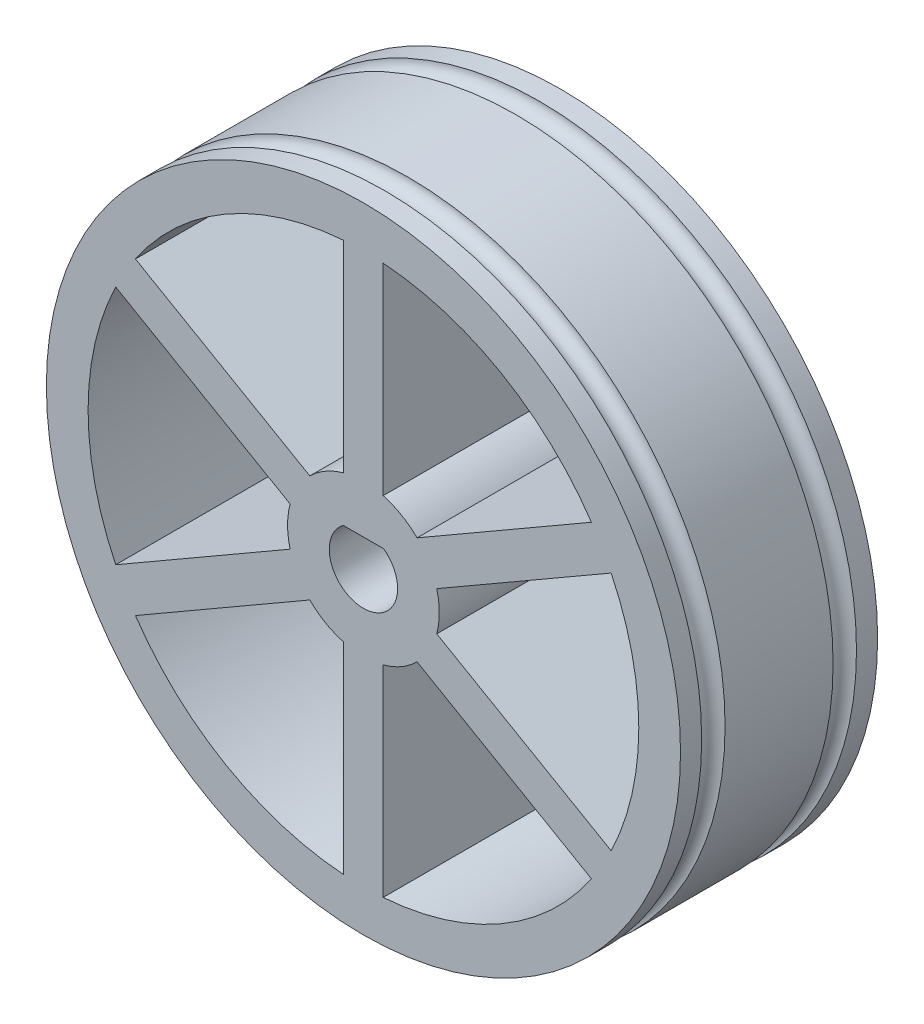
ISO-10303-21;
HEADER;
FILE_DESCRIPTION(('STEP AP214'),'2;1');
FILE_NAME('part.step','',(''),(''),'','','');
FILE_SCHEMA(('AUTOMOTIVE_DESIGN { 1 0 10303 214 1 1 1 1 }'));
ENDSEC;
DATA;
#1=APPLICATION_CONTEXT('core data for automotive mechanical design processes');
#2=APPLICATION_PROTOCOL_DEFINITION('international standard','automotive_design',2000,#1);
#3=PRODUCT_CONTEXT('',#1,'mechanical');
#4=PRODUCT('Part','Part','',(#3));
#5=PRODUCT_RELATED_PRODUCT_CATEGORY('part','',(#4));
#6=PRODUCT_DEFINITION_FORMATION('','',#4);
#7=PRODUCT_DEFINITION_CONTEXT('part definition',#1,'design');
#8=PRODUCT_DEFINITION('design','',#6,#7);
#9=PRODUCT_DEFINITION_SHAPE('','',#8);
#10=(LENGTH_UNIT() NAMED_UNIT(*) SI_UNIT(.MILLI.,.METRE.));
#11=(NAMED_UNIT(*) PLANE_ANGLE_UNIT() SI_UNIT($,.RADIAN.));
#12=(NAMED_UNIT(*) SI_UNIT($,.STERADIAN.) SOLID_ANGLE_UNIT());
#13=UNCERTAINTY_MEASURE_WITH_UNIT(LENGTH_MEASURE(1.E-05),#10,'distance_accuracy_value','');
#14=(GEOMETRIC_REPRESENTATION_CONTEXT(3) GLOBAL_UNCERTAINTY_ASSIGNED_CONTEXT((#13)) GLOBAL_UNIT_ASSIGNED_CONTEXT((#10,
#11,#12)) REPRESENTATION_CONTEXT('',''));
#15=CARTESIAN_POINT('',(0.,0.,0.));
#16=DIRECTION('',(0.,0.,1.));
#17=DIRECTION('',(1.,0.,0.));
#18=AXIS2_PLACEMENT_3D('',#15,#16,#17);
#19=CARTESIAN_POINT('',(0.,0.,15.));
#20=DIRECTION('',(0.,0.,-1.));
#21=DIRECTION('',(-1.,0.,0.));
#22=AXIS2_PLACEMENT_3D('',#19,#20,#21);
#23=CYLINDRICAL_SURFACE('',#22,24.13);
#24=CARTESIAN_POINT('',(0.,0.,1.61));
#25=DIRECTION('',(0.,0.,1.));
#26=DIRECTION('',(1.,0.,0.));
#27=AXIS2_PLACEMENT_3D('',#24,#25,#26);
#28=CIRCLE('',#27,24.13);
#29=CARTESIAN_POINT('',(24.13,0.,1.61));
#30=VERTEX_POINT('',#29);
#31=EDGE_CURVE('E293',#30,#30,#28,.F.);
#32=ORIENTED_EDGE('',*,*,#31,.T.);
#33=EDGE_LOOP('',(#32));
#34=FACE_BOUND('',#33,.T.);
#35=CARTESIAN_POINT('',(0.,0.,0.));
#36=DIRECTION('',(0.,0.,1.));
#37=DIRECTION('',(1.,0.,0.));
#38=AXIS2_PLACEMENT_3D('',#35,#36,#37);
#39=CIRCLE('',#38,24.13);
#40=CARTESIAN_POINT('',(24.13,0.,0.));
#41=VERTEX_POINT('',#40);
#42=EDGE_CURVE('E280',#41,#41,#39,.T.);
#43=ORIENTED_EDGE('',*,*,#42,.T.);
#44=EDGE_LOOP('',(#43));
#45=FACE_BOUND('',#44,.T.);
#46=ADVANCED_FACE('F46',(#34,#45),#23,.T.);
#47=CARTESIAN_POINT('',(0.,0.,15.));
#48=DIRECTION('',(0.,0.,-1.));
#49=DIRECTION('',(-1.,0.,0.));
#50=AXIS2_PLACEMENT_3D('',#47,#48,#49);
#51=CYLINDRICAL_SURFACE('',#50,20.955);
#52=DIRECTION('',(0.,0.,-1.));
#53=VECTOR('',#52,1.);
#54=CARTESIAN_POINT('',(17.3510087771371,11.7496603957608,15.));
#55=LINE('',#54,#53);
#56=CARTESIAN_POINT('',(17.3510087771371,11.7496603957608,15.));
#57=VERTEX_POINT('',#56);
#58=CARTESIAN_POINT('',(17.3510087771371,11.7496603957608,0.));
#59=VERTEX_POINT('',#58);
#60=EDGE_CURVE('E327',#57,#59,#55,.T.);
#61=ORIENTED_EDGE('',*,*,#60,.F.);
#62=CARTESIAN_POINT('',(0.,0.,15.));
#63=DIRECTION('',(0.,0.,1.));
#64=DIRECTION('',(1.,0.,0.));
#65=AXIS2_PLACEMENT_3D('',#62,#63,#64);
#66=CIRCLE('',#65,20.955);
#67=CARTESIAN_POINT('',(1.5,20.9012445801679,15.));
#68=VERTEX_POINT('',#67);
#69=EDGE_CURVE('E273',#57,#68,#66,.T.);
#70=ORIENTED_EDGE('',*,*,#69,.T.);
#71=DIRECTION('',(0.,0.,-1.));
#72=VECTOR('',#71,1.);
#73=CARTESIAN_POINT('',(1.5,20.9012445801679,15.));
#74=LINE('',#73,#72);
#75=CARTESIAN_POINT('',(1.5,20.9012445801679,0.));
#76=VERTEX_POINT('',#75);
#77=EDGE_CURVE('E261',#76,#68,#74,.F.);
#78=ORIENTED_EDGE('',*,*,#77,.F.);
#79=CARTESIAN_POINT('',(0.,0.,0.));
#80=DIRECTION('',(0.,0.,1.));
#81=DIRECTION('',(1.,0.,0.));
#82=AXIS2_PLACEMENT_3D('',#79,#80,#81);
#83=CIRCLE('',#82,20.955);
#84=EDGE_CURVE('E268',#59,#76,#83,.T.);
#85=ORIENTED_EDGE('',*,*,#84,.F.);
#86=EDGE_LOOP('',(#61,#70,#78,#85));
#87=FACE_BOUND('',#86,.T.);
#88=ADVANCED_FACE('F463',(#87),#51,.F.);
#89=CARTESIAN_POINT('',(0.,0.,15.));
#90=DIRECTION('',(0.,0.,-1.));
#91=DIRECTION('',(-1.,0.,0.));
#92=AXIS2_PLACEMENT_3D('',#89,#90,#91);
#93=CYLINDRICAL_SURFACE('',#92,5.775);
#94=CARTESIAN_POINT('',(0.,0.,15.));
#95=DIRECTION('',(0.,0.,1.));
#96=DIRECTION('',(1.,0.,0.));
#97=AXIS2_PLACEMENT_3D('',#94,#95,#96);
#98=CIRCLE('',#97,5.775);
#99=CARTESIAN_POINT('',(4.07964478507473,4.0874348224299,15.));
#100=VERTEX_POINT('',#99);
#101=CARTESIAN_POINT('',(1.5,5.57679343350639,15.));
#102=VERTEX_POINT('',#101);
#103=EDGE_CURVE('E411',#100,#102,#98,.T.);
#104=ORIENTED_EDGE('',*,*,#103,.F.);
#105=DIRECTION('',(0.,0.,-1.));
#106=VECTOR('',#105,1.);
#107=CARTESIAN_POINT('',(4.07964478507473,4.0874348224299,15.));
#108=LINE('',#107,#106);
#109=CARTESIAN_POINT('',(4.07964478507473,4.0874348224299,0.));
#110=VERTEX_POINT('',#109);
#111=EDGE_CURVE('E324',#100,#110,#108,.T.);
#112=ORIENTED_EDGE('',*,*,#111,.T.);
#113=CARTESIAN_POINT('',(0.,0.,0.));
#114=DIRECTION('',(0.,0.,1.));
#115=DIRECTION('',(1.,0.,0.));
#116=AXIS2_PLACEMENT_3D('',#113,#114,#115);
#117=CIRCLE('',#116,5.775);
#118=CARTESIAN_POINT('',(1.5,5.57679343350639,0.));
#119=VERTEX_POINT('',#118);
#120=EDGE_CURVE('E234',#110,#119,#117,.T.);
#121=ORIENTED_EDGE('',*,*,#120,.T.);
#122=DIRECTION('',(0.,0.,-1.));
#123=VECTOR('',#122,1.);
#124=CARTESIAN_POINT('',(1.5,5.57679343350639,15.));
#125=LINE('',#124,#123);
#126=EDGE_CURVE('E276',#102,#119,#125,.T.);
#127=ORIENTED_EDGE('',*,*,#126,.F.);
#128=EDGE_LOOP('',(#104,#112,#121,#127));
#129=FACE_BOUND('',#128,.T.);
#130=ADVANCED_FACE('F468',(#129),#93,.T.);
#131=DIRECTION('',(0.,0.,-1.));
#132=VECTOR('',#131,1.);
#133=CARTESIAN_POINT('',(18.8510087771371,9.15158418440754,15.));
#134=LINE('',#133,#132);
#135=CARTESIAN_POINT('',(18.8510087771371,9.15158418440754,0.));
#136=VERTEX_POINT('',#135);
#137=CARTESIAN_POINT('',(18.8510087771371,9.15158418440754,15.));
#138=VERTEX_POINT('',#137);
#139=EDGE_CURVE('E322',#136,#138,#134,.F.);
#140=ORIENTED_EDGE('',*,*,#139,.F.);
#141=CARTESIAN_POINT('',(18.8510087771373,-9.15158418440714,0.));
#142=VERTEX_POINT('',#141);
#143=EDGE_CURVE('E457',#142,#136,#83,.T.);
#144=ORIENTED_EDGE('',*,*,#143,.F.);
#145=DIRECTION('',(0.,0.,-1.));
#146=VECTOR('',#145,1.);
#147=CARTESIAN_POINT('',(18.8510087771373,-9.15158418440714,15.));
#148=LINE('',#147,#146);
#149=CARTESIAN_POINT('',(18.8510087771373,-9.15158418440714,15.));
#150=VERTEX_POINT('',#149);
#151=EDGE_CURVE('E350',#150,#142,#148,.T.);
#152=ORIENTED_EDGE('',*,*,#151,.F.);
#153=EDGE_CURVE('E472',#150,#138,#66,.T.);
#154=ORIENTED_EDGE('',*,*,#153,.T.);
#155=EDGE_LOOP('',(#140,#144,#152,#154));
#156=FACE_BOUND('',#155,.T.);
#157=ADVANCED_FACE('F507',(#156),#51,.F.);
#158=CARTESIAN_POINT('',(5.57964478507479,-1.48935861107649,0.));
#159=VERTEX_POINT('',#158);
#160=CARTESIAN_POINT('',(5.57964478507476,1.4893586110766,0.));
#161=VERTEX_POINT('',#160);
#162=EDGE_CURVE('E237',#159,#161,#117,.T.);
#163=ORIENTED_EDGE('',*,*,#162,.T.);
#164=DIRECTION('',(0.,0.,-1.));
#165=VECTOR('',#164,1.);
#166=CARTESIAN_POINT('',(5.57964478507476,1.4893586110766,15.));
#167=LINE('',#166,#165);
#168=CARTESIAN_POINT('',(5.57964478507476,1.4893586110766,15.));
#169=VERTEX_POINT('',#168);
#170=EDGE_CURVE('E318',#161,#169,#167,.F.);
#171=ORIENTED_EDGE('',*,*,#170,.T.);
#172=CARTESIAN_POINT('',(5.57964478507479,-1.48935861107649,15.));
#173=VERTEX_POINT('',#172);
#174=EDGE_CURVE('E412',#173,#169,#98,.T.);
#175=ORIENTED_EDGE('',*,*,#174,.F.);
#176=DIRECTION('',(0.,0.,-1.));
#177=VECTOR('',#176,1.);
#178=CARTESIAN_POINT('',(5.57964478507479,-1.48935861107649,15.));
#179=LINE('',#178,#177);
#180=EDGE_CURVE('E347',#173,#159,#179,.T.);
#181=ORIENTED_EDGE('',*,*,#180,.T.);
#182=EDGE_LOOP('',(#163,#171,#175,#181));
#183=FACE_BOUND('',#182,.T.);
#184=ADVANCED_FACE('F683',(#183),#93,.T.);
#185=DIRECTION('',(0.,0.,-1.));
#186=VECTOR('',#185,1.);
#187=CARTESIAN_POINT('',(17.3510087771374,-11.7496603957605,15.));
#188=LINE('',#187,#186);
#189=CARTESIAN_POINT('',(17.3510087771374,-11.7496603957605,0.));
#190=VERTEX_POINT('',#189);
#191=CARTESIAN_POINT('',(17.3510087771374,-11.7496603957605,15.));
#192=VERTEX_POINT('',#191);
#193=EDGE_CURVE('E344',#190,#192,#188,.F.);
#194=ORIENTED_EDGE('',*,*,#193,.F.);
#195=CARTESIAN_POINT('',(1.5,-20.9012445801679,0.));
#196=VERTEX_POINT('',#195);
#197=EDGE_CURVE('E454',#196,#190,#83,.T.);
#198=ORIENTED_EDGE('',*,*,#197,.F.);
#199=DIRECTION('',(0.,0.,-1.));
#200=VECTOR('',#199,1.);
#201=CARTESIAN_POINT('',(1.5,-20.9012445801679,15.));
#202=LINE('',#201,#200);
#203=CARTESIAN_POINT('',(1.5,-20.9012445801679,15.));
#204=VERTEX_POINT('',#203);
#205=EDGE_CURVE('E373',#204,#196,#202,.T.);
#206=ORIENTED_EDGE('',*,*,#205,.F.);
#207=EDGE_CURVE('E473',#204,#192,#66,.T.);
#208=ORIENTED_EDGE('',*,*,#207,.T.);
#209=EDGE_LOOP('',(#194,#198,#206,#208));
#210=FACE_BOUND('',#209,.T.);
#211=ADVANCED_FACE('F676',(#210),#51,.F.);
#212=CARTESIAN_POINT('',(1.5,-5.57679343350639,0.));
#213=VERTEX_POINT('',#212);
#214=CARTESIAN_POINT('',(4.07964478507482,-4.08743482242982,0.));
#215=VERTEX_POINT('',#214);
#216=EDGE_CURVE('E447',#213,#215,#117,.T.);
#217=ORIENTED_EDGE('',*,*,#216,.T.);
#218=DIRECTION('',(0.,0.,-1.));
#219=VECTOR('',#218,1.);
#220=CARTESIAN_POINT('',(4.07964478507482,-4.08743482242981,15.));
#221=LINE('',#220,#219);
#222=CARTESIAN_POINT('',(4.07964478507482,-4.08743482242981,15.));
#223=VERTEX_POINT('',#222);
#224=EDGE_CURVE('E339',#215,#223,#221,.F.);
#225=ORIENTED_EDGE('',*,*,#224,.T.);
#226=CARTESIAN_POINT('',(1.5,-5.57679343350639,15.));
#227=VERTEX_POINT('',#226);
#228=EDGE_CURVE('E419',#227,#223,#98,.T.);
#229=ORIENTED_EDGE('',*,*,#228,.F.);
#230=DIRECTION('',(0.,0.,-1.));
#231=VECTOR('',#230,1.);
#232=CARTESIAN_POINT('',(1.5,-5.57679343350639,15.));
#233=LINE('',#232,#231);
#234=EDGE_CURVE('E370',#227,#213,#233,.T.);
#235=ORIENTED_EDGE('',*,*,#234,.T.);
#236=EDGE_LOOP('',(#217,#225,#229,#235));
#237=FACE_BOUND('',#236,.T.);
#238=ADVANCED_FACE('F445',(#237),#93,.T.);
#239=DIRECTION('',(0.,0.,-1.));
#240=VECTOR('',#239,1.);
#241=CARTESIAN_POINT('',(-1.5,-20.9012445801679,15.));
#242=LINE('',#241,#240);
#243=CARTESIAN_POINT('',(-1.5,-20.9012445801679,0.));
#244=VERTEX_POINT('',#243);
#245=CARTESIAN_POINT('',(-1.5,-20.9012445801679,15.));
#246=VERTEX_POINT('',#245);
#247=EDGE_CURVE('E367',#244,#246,#242,.F.);
#248=ORIENTED_EDGE('',*,*,#247,.F.);
#249=CARTESIAN_POINT('',(-17.3510087771372,-11.7496603957607,0.));
#250=VERTEX_POINT('',#249);
#251=EDGE_CURVE('E456',#250,#244,#83,.T.);
#252=ORIENTED_EDGE('',*,*,#251,.F.);
#253=DIRECTION('',(0.,0.,-1.));
#254=VECTOR('',#253,1.);
#255=CARTESIAN_POINT('',(-17.3510087771372,-11.7496603957607,15.));
#256=LINE('',#255,#254);
#257=CARTESIAN_POINT('',(-17.3510087771372,-11.7496603957607,15.));
#258=VERTEX_POINT('',#257);
#259=EDGE_CURVE('E396',#258,#250,#256,.T.);
#260=ORIENTED_EDGE('',*,*,#259,.F.);
#261=EDGE_CURVE('E476',#258,#246,#66,.T.);
#262=ORIENTED_EDGE('',*,*,#261,.T.);
#263=EDGE_LOOP('',(#248,#252,#260,#262));
#264=FACE_BOUND('',#263,.T.);
#265=ADVANCED_FACE('F662',(#264),#51,.F.);
#266=CARTESIAN_POINT('',(-4.07964478507475,-4.08743482242987,0.));
#267=VERTEX_POINT('',#266);
#268=CARTESIAN_POINT('',(-1.5,-5.57679343350639,0.));
#269=VERTEX_POINT('',#268);
#270=EDGE_CURVE('E863',#267,#269,#117,.T.);
#271=ORIENTED_EDGE('',*,*,#270,.T.);
#272=DIRECTION('',(0.,0.,-1.));
#273=VECTOR('',#272,1.);
#274=CARTESIAN_POINT('',(-1.5,-5.57679343350639,15.));
#275=LINE('',#274,#273);
#276=CARTESIAN_POINT('',(-1.5,-5.57679343350639,15.));
#277=VERTEX_POINT('',#276);
#278=EDGE_CURVE('E362',#269,#277,#275,.F.);
#279=ORIENTED_EDGE('',*,*,#278,.T.);
#280=CARTESIAN_POINT('',(-4.07964478507475,-4.08743482242987,15.));
#281=VERTEX_POINT('',#280);
#282=EDGE_CURVE('E426',#281,#277,#98,.T.);
#283=ORIENTED_EDGE('',*,*,#282,.F.);
#284=DIRECTION('',(0.,0.,-1.));
#285=VECTOR('',#284,1.);
#286=CARTESIAN_POINT('',(-4.07964478507476,-4.08743482242987,15.));
#287=LINE('',#286,#285);
#288=EDGE_CURVE('E393',#281,#267,#287,.T.);
#289=ORIENTED_EDGE('',*,*,#288,.T.);
#290=EDGE_LOOP('',(#271,#279,#283,#289));
#291=FACE_BOUND('',#290,.T.);
#292=ADVANCED_FACE('F655',(#291),#93,.T.);
#293=DIRECTION('',(0.,0.,-1.));
#294=VECTOR('',#293,1.);
#295=CARTESIAN_POINT('',(-18.8510087771372,-9.1515841844074,15.));
#296=LINE('',#295,#294);
#297=CARTESIAN_POINT('',(-18.8510087771372,-9.1515841844074,0.));
#298=VERTEX_POINT('',#297);
#299=CARTESIAN_POINT('',(-18.8510087771372,-9.1515841844074,15.));
#300=VERTEX_POINT('',#299);
#301=EDGE_CURVE('E390',#298,#300,#296,.F.);
#302=ORIENTED_EDGE('',*,*,#301,.F.);
#303=CARTESIAN_POINT('',(-18.8510087771373,9.15158418440727,0.));
#304=VERTEX_POINT('',#303);
#305=EDGE_CURVE('E281',#304,#298,#83,.T.);
#306=ORIENTED_EDGE('',*,*,#305,.F.);
#307=DIRECTION('',(0.,0.,-1.));
#308=VECTOR('',#307,1.);
#309=CARTESIAN_POINT('',(-18.8510087771373,9.15158418440727,15.));
#310=LINE('',#309,#308);
#311=CARTESIAN_POINT('',(-18.8510087771373,9.15158418440727,15.));
#312=VERTEX_POINT('',#311);
#313=EDGE_CURVE('E235',#312,#304,#310,.T.);
#314=ORIENTED_EDGE('',*,*,#313,.F.);
#315=EDGE_CURVE('E272',#312,#300,#66,.T.);
#316=ORIENTED_EDGE('',*,*,#315,.T.);
#317=EDGE_LOOP('',(#302,#306,#314,#316));
#318=FACE_BOUND('',#317,.T.);
#319=ADVANCED_FACE('F481',(#318),#51,.F.);
#320=CARTESIAN_POINT('',(-5.57964478507478,1.48935861107652,0.));
#321=VERTEX_POINT('',#320);
#322=CARTESIAN_POINT('',(-5.57964478507477,-1.48935861107656,0.));
#323=VERTEX_POINT('',#322);
#324=EDGE_CURVE('E248',#321,#323,#117,.T.);
#325=ORIENTED_EDGE('',*,*,#324,.T.);
#326=DIRECTION('',(0.,0.,-1.));
#327=VECTOR('',#326,1.);
#328=CARTESIAN_POINT('',(-5.57964478507477,-1.48935861107656,15.));
#329=LINE('',#328,#327);
#330=CARTESIAN_POINT('',(-5.57964478507477,-1.48935861107656,15.));
#331=VERTEX_POINT('',#330);
#332=EDGE_CURVE('E385',#323,#331,#329,.F.);
#333=ORIENTED_EDGE('',*,*,#332,.T.);
#334=CARTESIAN_POINT('',(-5.57964478507478,1.48935861107652,15.));
#335=VERTEX_POINT('',#334);
#336=EDGE_CURVE('E421',#335,#331,#98,.T.);
#337=ORIENTED_EDGE('',*,*,#336,.F.);
#338=DIRECTION('',(0.,0.,-1.));
#339=VECTOR('',#338,1.);
#340=CARTESIAN_POINT('',(-5.57964478507478,1.48935861107652,15.));
#341=LINE('',#340,#339);
#342=EDGE_CURVE('E231',#335,#321,#341,.T.);
#343=ORIENTED_EDGE('',*,*,#342,.T.);
#344=EDGE_LOOP('',(#325,#333,#337,#343));
#345=FACE_BOUND('',#344,.T.);
#346=ADVANCED_FACE('F521',(#345),#93,.T.);
#347=CARTESIAN_POINT('',(-1.5,20.955,33.5985490025432));
#348=DIRECTION('',(-1.,0.,0.));
#349=DIRECTION('',(0.,0.,1.));
#350=AXIS2_PLACEMENT_3D('',#347,#348,#349);
#351=PLANE('',#350);
#352=DIRECTION('',(0.,1.,0.));
#353=VECTOR('',#352,1.);
#354=CARTESIAN_POINT('',(-1.5,20.955,0.));
#355=LINE('',#354,#353);
#356=CARTESIAN_POINT('',(-1.5,5.57679343350639,0.));
#357=VERTEX_POINT('',#356);
#358=CARTESIAN_POINT('',(-1.5,20.9012445801679,0.));
#359=VERTEX_POINT('',#358);
#360=EDGE_CURVE('E253',#357,#359,#355,.T.);
#361=ORIENTED_EDGE('',*,*,#360,.F.);
#362=DIRECTION('',(0.,0.,-1.));
#363=VECTOR('',#362,1.);
#364=CARTESIAN_POINT('',(-1.5,5.57679343350639,15.));
#365=LINE('',#364,#363);
#366=CARTESIAN_POINT('',(-1.5,5.57679343350639,15.));
#367=VERTEX_POINT('',#366);
#368=EDGE_CURVE('E249',#357,#367,#365,.F.);
#369=ORIENTED_EDGE('',*,*,#368,.T.);
#370=DIRECTION('',(0.,1.,0.));
#371=VECTOR('',#370,1.);
#372=CARTESIAN_POINT('',(-1.5,20.955,15.));
#373=LINE('',#372,#371);
#374=CARTESIAN_POINT('',(-1.5,20.9012445801679,15.));
#375=VERTEX_POINT('',#374);
#376=EDGE_CURVE('E255',#367,#375,#373,.T.);
#377=ORIENTED_EDGE('',*,*,#376,.T.);
#378=DIRECTION('',(0.,0.,-1.));
#379=VECTOR('',#378,1.);
#380=CARTESIAN_POINT('',(-1.5,20.9012445801679,15.));
#381=LINE('',#380,#379);
#382=EDGE_CURVE('E265',#375,#359,#381,.T.);
#383=ORIENTED_EDGE('',*,*,#382,.T.);
#384=EDGE_LOOP('',(#361,#369,#377,#383));
#385=FACE_BOUND('',#384,.T.);
#386=ADVANCED_FACE('F518',(#385),#351,.T.);
#387=CARTESIAN_POINT('',(1.5,20.955,33.5985490025432));
#388=DIRECTION('',(1.,0.,0.));
#389=DIRECTION('',(0.,0.,-1.));
#390=AXIS2_PLACEMENT_3D('',#387,#388,#389);
#391=PLANE('',#390);
#392=DIRECTION('',(0.,-1.,0.));
#393=VECTOR('',#392,1.);
#394=CARTESIAN_POINT('',(1.5,20.955,15.));
#395=LINE('',#394,#393);
#396=EDGE_CURVE('E258',#68,#102,#395,.T.);
#397=ORIENTED_EDGE('',*,*,#396,.T.);
#398=ORIENTED_EDGE('',*,*,#126,.T.);
#399=DIRECTION('',(0.,-1.,0.));
#400=VECTOR('',#399,1.);
#401=CARTESIAN_POINT('',(1.5,20.955,0.));
#402=LINE('',#401,#400);
#403=EDGE_CURVE('E252',#76,#119,#402,.T.);
#404=ORIENTED_EDGE('',*,*,#403,.F.);
#405=ORIENTED_EDGE('',*,*,#77,.T.);
#406=EDGE_LOOP('',(#397,#398,#404,#405));
#407=FACE_BOUND('',#406,.T.);
#408=ADVANCED_FACE('F466',(#407),#391,.T.);
#409=DIRECTION('',(0.,0.,-1.));
#410=VECTOR('',#409,1.);
#411=CARTESIAN_POINT('',(-17.3510087771373,11.7496603957606,15.));
#412=LINE('',#411,#410);
#413=CARTESIAN_POINT('',(-17.3510087771373,11.7496603957606,0.));
#414=VERTEX_POINT('',#413);
#415=CARTESIAN_POINT('',(-17.3510087771373,11.7496603957606,15.));
#416=VERTEX_POINT('',#415);
#417=EDGE_CURVE('E241',#414,#416,#412,.F.);
#418=ORIENTED_EDGE('',*,*,#417,.F.);
#419=EDGE_CURVE('E277',#359,#414,#83,.T.);
#420=ORIENTED_EDGE('',*,*,#419,.F.);
#421=ORIENTED_EDGE('',*,*,#382,.F.);
#422=EDGE_CURVE('E269',#375,#416,#66,.T.);
#423=ORIENTED_EDGE('',*,*,#422,.T.);
#424=EDGE_LOOP('',(#418,#420,#421,#423));
#425=FACE_BOUND('',#424,.T.);
#426=ADVANCED_FACE('F48',(#425),#51,.F.);
#427=CARTESIAN_POINT('',(0.,0.,13.39));
#428=DIRECTION('',(0.,0.,-1.));
#429=DIRECTION('',(-1.,0.,0.));
#430=AXIS2_PLACEMENT_3D('',#427,#428,#429);
#431=CIRCLE('',#430,24.13);
#432=CARTESIAN_POINT('',(-24.13,0.,13.39));
#433=VERTEX_POINT('',#432);
#434=EDGE_CURVE('E296',#433,#433,#431,.F.);
#435=ORIENTED_EDGE('',*,*,#434,.T.);
#436=EDGE_LOOP('',(#435));
#437=FACE_BOUND('',#436,.T.);
#438=CARTESIAN_POINT('',(0.,0.,15.));
#439=DIRECTION('',(0.,0.,1.));
#440=DIRECTION('',(1.,0.,0.));
#441=AXIS2_PLACEMENT_3D('',#438,#439,#440);
#442=CIRCLE('',#441,24.13);
#443=CARTESIAN_POINT('',(24.13,0.,15.));
#444=VERTEX_POINT('',#443);
#445=EDGE_CURVE('E271',#444,#444,#442,.T.);
#446=ORIENTED_EDGE('',*,*,#445,.F.);
#447=EDGE_LOOP('',(#446));
#448=FACE_BOUND('',#447,.T.);
#449=ADVANCED_FACE('F487',(#437,#448),#23,.T.);
#450=CARTESIAN_POINT('',(0.,0.,15.));
#451=DIRECTION('',(0.,0.,1.));
#452=DIRECTION('',(1.,0.,0.));
#453=AXIS2_PLACEMENT_3D('',#450,#451,#452);
#454=PLANE('',#453);
#455=CARTESIAN_POINT('',(0.,0.,15.));
#456=DIRECTION('',(0.,0.,1.));
#457=DIRECTION('',(1.,0.,0.));
#458=AXIS2_PLACEMENT_3D('',#455,#456,#457);
#459=CIRCLE('',#458,2.6);
#460=CARTESIAN_POINT('',(-1.53297097167559,2.1,15.));
#461=VERTEX_POINT('',#460);
#462=CARTESIAN_POINT('',(1.53297097167559,2.1,15.));
#463=VERTEX_POINT('',#462);
#464=EDGE_CURVE('E230',#461,#463,#459,.T.);
#465=ORIENTED_EDGE('',*,*,#464,.F.);
#466=DIRECTION('',(1.,0.,0.));
#467=VECTOR('',#466,1.);
#468=CARTESIAN_POINT('',(2.5,2.1,15.));
#469=LINE('',#468,#467);
#470=EDGE_CURVE('E223',#461,#463,#469,.T.);
#471=ORIENTED_EDGE('',*,*,#470,.T.);
#472=EDGE_LOOP('',(#465,#471));
#473=FACE_BOUND('',#472,.T.);
#474=ORIENTED_EDGE('',*,*,#69,.F.);
#475=DIRECTION('',(0.866025403784433,0.50000000000001,0.));
#476=VECTOR('',#475,1.);
#477=CARTESIAN_POINT('',(17.3975623363028,11.7765381056769,15.));
#478=LINE('',#477,#476);
#479=EDGE_CURVE('E313',#100,#57,#478,.T.);
#480=ORIENTED_EDGE('',*,*,#479,.F.);
#481=ORIENTED_EDGE('',*,*,#103,.T.);
#482=ORIENTED_EDGE('',*,*,#396,.F.);
#483=EDGE_LOOP('',(#474,#480,#481,#482));
#484=FACE_BOUND('',#483,.T.);
#485=DIRECTION('',(-0.866025403784433,-0.50000000000001,0.));
#486=VECTOR('',#485,1.);
#487=CARTESIAN_POINT('',(18.8975623363028,9.17846189432356,15.));
#488=LINE('',#487,#486);
#489=EDGE_CURVE('E67',#138,#169,#488,.T.);
#490=ORIENTED_EDGE('',*,*,#489,.F.);
#491=ORIENTED_EDGE('',*,*,#153,.F.);
#492=DIRECTION('',(0.866025403784443,-0.499999999999992,0.));
#493=VECTOR('',#492,1.);
#494=CARTESIAN_POINT('',(18.897562336303,-9.17846189432317,15.));
#495=LINE('',#494,#493);
#496=EDGE_CURVE('E334',#173,#150,#495,.T.);
#497=ORIENTED_EDGE('',*,*,#496,.F.);
#498=ORIENTED_EDGE('',*,*,#174,.T.);
#499=EDGE_LOOP('',(#490,#491,#497,#498));
#500=FACE_BOUND('',#499,.T.);
#501=DIRECTION('',(-0.866025403784443,0.499999999999992,0.));
#502=VECTOR('',#501,1.);
#503=CARTESIAN_POINT('',(17.397562336303,-11.7765381056765,15.));
#504=LINE('',#503,#502);
#505=EDGE_CURVE('E337',#192,#223,#504,.T.);
#506=ORIENTED_EDGE('',*,*,#505,.F.);
#507=ORIENTED_EDGE('',*,*,#207,.F.);
#508=DIRECTION('',(0.,-1.,0.));
#509=VECTOR('',#508,1.);
#510=CARTESIAN_POINT('',(1.5,-20.955,15.));
#511=LINE('',#510,#509);
#512=EDGE_CURVE('E357',#227,#204,#511,.T.);
#513=ORIENTED_EDGE('',*,*,#512,.F.);
#514=ORIENTED_EDGE('',*,*,#228,.T.);
#515=EDGE_LOOP('',(#506,#507,#513,#514));
#516=FACE_BOUND('',#515,.T.);
#517=DIRECTION('',(0.,1.,0.));
#518=VECTOR('',#517,1.);
#519=CARTESIAN_POINT('',(-1.5,-20.955,15.));
#520=LINE('',#519,#518);
#521=EDGE_CURVE('E360',#246,#277,#520,.T.);
#522=ORIENTED_EDGE('',*,*,#521,.F.);
#523=ORIENTED_EDGE('',*,*,#261,.F.);
#524=DIRECTION('',(-0.866025403784436,-0.500000000000004,0.));
#525=VECTOR('',#524,1.);
#526=CARTESIAN_POINT('',(-17.3975623363029,-11.7765381056767,15.));
#527=LINE('',#526,#525);
#528=EDGE_CURVE('E380',#281,#258,#527,.T.);
#529=ORIENTED_EDGE('',*,*,#528,.F.);
#530=ORIENTED_EDGE('',*,*,#282,.T.);
#531=EDGE_LOOP('',(#522,#523,#529,#530));
#532=FACE_BOUND('',#531,.T.);
#533=DIRECTION('',(0.866025403784436,0.500000000000004,0.));
#534=VECTOR('',#533,1.);
#535=CARTESIAN_POINT('',(-18.8975623363029,-9.17846189432343,15.));
#536=LINE('',#535,#534);
#537=EDGE_CURVE('E383',#300,#331,#536,.T.);
#538=ORIENTED_EDGE('',*,*,#537,.F.);
#539=ORIENTED_EDGE('',*,*,#315,.F.);
#540=DIRECTION('',(-0.86602540378444,0.499999999999998,0.));
#541=VECTOR('',#540,1.);
#542=CARTESIAN_POINT('',(-18.8975623363029,9.1784618943233,15.));
#543=LINE('',#542,#541);
#544=EDGE_CURVE('E403',#335,#312,#543,.T.);
#545=ORIENTED_EDGE('',*,*,#544,.F.);
#546=ORIENTED_EDGE('',*,*,#336,.T.);
#547=EDGE_LOOP('',(#538,#539,#545,#546));
#548=FACE_BOUND('',#547,.T.);
#549=DIRECTION('',(0.86602540378444,-0.499999999999998,0.));
#550=VECTOR('',#549,1.);
#551=CARTESIAN_POINT('',(-17.3975623363029,11.7765381056766,15.));
#552=LINE('',#551,#550);
#553=CARTESIAN_POINT('',(-4.07964478507479,4.08743482242985,15.));
#554=VERTEX_POINT('',#553);
#555=EDGE_CURVE('E406',#416,#554,#552,.T.);
#556=ORIENTED_EDGE('',*,*,#555,.F.);
#557=ORIENTED_EDGE('',*,*,#422,.F.);
#558=ORIENTED_EDGE('',*,*,#376,.F.);
#559=EDGE_CURVE('E244',#367,#554,#98,.T.);
#560=ORIENTED_EDGE('',*,*,#559,.T.);
#561=EDGE_LOOP('',(#556,#557,#558,#560));
#562=FACE_BOUND('',#561,.T.);
#563=ORIENTED_EDGE('',*,*,#445,.T.);
#564=EDGE_LOOP('',(#563));
#565=FACE_BOUND('',#564,.T.);
#566=ADVANCED_FACE('F441',(#473,#484,#500,#516,#532,#548,#562,#565),#454,.T.);
#567=CARTESIAN_POINT('',(0.,0.,0.));
#568=DIRECTION('',(0.,0.,1.));
#569=DIRECTION('',(1.,0.,0.));
#570=AXIS2_PLACEMENT_3D('',#567,#568,#569);
#571=PLANE('',#570);
#572=DIRECTION('',(-1.,0.,0.));
#573=VECTOR('',#572,1.);
#574=CARTESIAN_POINT('',(2.5,2.1,0.));
#575=LINE('',#574,#573);
#576=CARTESIAN_POINT('',(1.53297097167559,2.1,0.));
#577=VERTEX_POINT('',#576);
#578=CARTESIAN_POINT('',(-1.53297097167559,2.1,0.));
#579=VERTEX_POINT('',#578);
#580=EDGE_CURVE('E60',#577,#579,#575,.T.);
#581=ORIENTED_EDGE('',*,*,#580,.T.);
#582=CARTESIAN_POINT('',(0.,0.,0.));
#583=DIRECTION('',(0.,0.,1.));
#584=DIRECTION('',(1.,0.,0.));
#585=AXIS2_PLACEMENT_3D('',#582,#583,#584);
#586=CIRCLE('',#585,2.6);
#587=EDGE_CURVE('E228',#579,#577,#586,.T.);
#588=ORIENTED_EDGE('',*,*,#587,.T.);
#589=EDGE_LOOP('',(#581,#588));
#590=FACE_BOUND('',#589,.T.);
#591=DIRECTION('',(0.866025403784433,0.50000000000001,0.));
#592=VECTOR('',#591,1.);
#593=CARTESIAN_POINT('',(17.3975623363028,11.7765381056769,0.));
#594=LINE('',#593,#592);
#595=EDGE_CURVE('E305',#110,#59,#594,.T.);
#596=ORIENTED_EDGE('',*,*,#595,.T.);
#597=ORIENTED_EDGE('',*,*,#84,.T.);
#598=ORIENTED_EDGE('',*,*,#403,.T.);
#599=ORIENTED_EDGE('',*,*,#120,.F.);
#600=EDGE_LOOP('',(#596,#597,#598,#599));
#601=FACE_BOUND('',#600,.T.);
#602=ORIENTED_EDGE('',*,*,#143,.T.);
#603=DIRECTION('',(-0.866025403784433,-0.50000000000001,0.));
#604=VECTOR('',#603,1.);
#605=CARTESIAN_POINT('',(18.8975623363028,9.17846189432356,0.));
#606=LINE('',#605,#604);
#607=EDGE_CURVE('E301',#136,#161,#606,.T.);
#608=ORIENTED_EDGE('',*,*,#607,.T.);
#609=ORIENTED_EDGE('',*,*,#162,.F.);
#610=DIRECTION('',(0.866025403784443,-0.499999999999992,0.));
#611=VECTOR('',#610,1.);
#612=CARTESIAN_POINT('',(18.897562336303,-9.17846189432317,0.));
#613=LINE('',#612,#611);
#614=EDGE_CURVE('E331',#159,#142,#613,.T.);
#615=ORIENTED_EDGE('',*,*,#614,.T.);
#616=EDGE_LOOP('',(#602,#608,#609,#615));
#617=FACE_BOUND('',#616,.T.);
#618=ORIENTED_EDGE('',*,*,#197,.T.);
#619=DIRECTION('',(-0.866025403784443,0.499999999999992,0.));
#620=VECTOR('',#619,1.);
#621=CARTESIAN_POINT('',(17.397562336303,-11.7765381056765,0.));
#622=LINE('',#621,#620);
#623=EDGE_CURVE('E330',#190,#215,#622,.T.);
#624=ORIENTED_EDGE('',*,*,#623,.T.);
#625=ORIENTED_EDGE('',*,*,#216,.F.);
#626=DIRECTION('',(0.,-1.,0.));
#627=VECTOR('',#626,1.);
#628=CARTESIAN_POINT('',(1.5,-20.955,0.));
#629=LINE('',#628,#627);
#630=EDGE_CURVE('E354',#213,#196,#629,.T.);
#631=ORIENTED_EDGE('',*,*,#630,.T.);
#632=EDGE_LOOP('',(#618,#624,#625,#631));
#633=FACE_BOUND('',#632,.T.);
#634=ORIENTED_EDGE('',*,*,#251,.T.);
#635=DIRECTION('',(0.,1.,0.));
#636=VECTOR('',#635,1.);
#637=CARTESIAN_POINT('',(-1.5,-20.955,0.));
#638=LINE('',#637,#636);
#639=EDGE_CURVE('E353',#244,#269,#638,.T.);
#640=ORIENTED_EDGE('',*,*,#639,.T.);
#641=ORIENTED_EDGE('',*,*,#270,.F.);
#642=DIRECTION('',(-0.866025403784436,-0.500000000000004,0.));
#643=VECTOR('',#642,1.);
#644=CARTESIAN_POINT('',(-17.3975623363029,-11.7765381056767,0.));
#645=LINE('',#644,#643);
#646=EDGE_CURVE('E377',#267,#250,#645,.T.);
#647=ORIENTED_EDGE('',*,*,#646,.T.);
#648=EDGE_LOOP('',(#634,#640,#641,#647));
#649=FACE_BOUND('',#648,.T.);
#650=ORIENTED_EDGE('',*,*,#305,.T.);
#651=DIRECTION('',(0.866025403784436,0.500000000000004,0.));
#652=VECTOR('',#651,1.);
#653=CARTESIAN_POINT('',(-18.8975623363029,-9.17846189432343,0.));
#654=LINE('',#653,#652);
#655=EDGE_CURVE('E376',#298,#323,#654,.T.);
#656=ORIENTED_EDGE('',*,*,#655,.T.);
#657=ORIENTED_EDGE('',*,*,#324,.F.);
#658=DIRECTION('',(-0.86602540378444,0.499999999999998,0.));
#659=VECTOR('',#658,1.);
#660=CARTESIAN_POINT('',(-18.8975623363029,9.1784618943233,0.));
#661=LINE('',#660,#659);
#662=EDGE_CURVE('E400',#321,#304,#661,.T.);
#663=ORIENTED_EDGE('',*,*,#662,.T.);
#664=EDGE_LOOP('',(#650,#656,#657,#663));
#665=FACE_BOUND('',#664,.T.);
#666=ORIENTED_EDGE('',*,*,#419,.T.);
#667=DIRECTION('',(0.86602540378444,-0.499999999999998,0.));
#668=VECTOR('',#667,1.);
#669=CARTESIAN_POINT('',(-17.3975623363029,11.7765381056766,0.));
#670=LINE('',#669,#668);
#671=CARTESIAN_POINT('',(-4.07964478507479,4.08743482242984,0.));
#672=VERTEX_POINT('',#671);
#673=EDGE_CURVE('E399',#414,#672,#670,.T.);
#674=ORIENTED_EDGE('',*,*,#673,.T.);
#675=EDGE_CURVE('E239',#357,#672,#117,.T.);
#676=ORIENTED_EDGE('',*,*,#675,.F.);
#677=ORIENTED_EDGE('',*,*,#360,.T.);
#678=EDGE_LOOP('',(#666,#674,#676,#677));
#679=FACE_BOUND('',#678,.T.);
#680=ORIENTED_EDGE('',*,*,#42,.F.);
#681=EDGE_LOOP('',(#680));
#682=FACE_BOUND('',#681,.T.);
#683=ADVANCED_FACE('F232',(#590,#601,#617,#633,#649,#665,#679,#682),#571,.F.);
#684=CARTESIAN_POINT('',(0.,0.,15.));
#685=DIRECTION('',(0.,0.,-1.));
#686=DIRECTION('',(-1.,0.,0.));
#687=AXIS2_PLACEMENT_3D('',#684,#685,#686);
#688=CYLINDRICAL_SURFACE('',#687,2.6);
#689=DIRECTION('',(0.,0.,-1.));
#690=VECTOR('',#689,1.);
#691=CARTESIAN_POINT('',(-1.53297097167559,2.1,15.));
#692=LINE('',#691,#690);
#693=EDGE_CURVE('E12',#461,#579,#692,.T.);
#694=ORIENTED_EDGE('',*,*,#693,.F.);
#695=ORIENTED_EDGE('',*,*,#464,.T.);
#696=DIRECTION('',(0.,0.,-1.));
#697=VECTOR('',#696,1.);
#698=CARTESIAN_POINT('',(1.53297097167559,2.1,15.));
#699=LINE('',#698,#697);
#700=EDGE_CURVE('E54',#577,#463,#699,.F.);
#701=ORIENTED_EDGE('',*,*,#700,.F.);
#702=ORIENTED_EDGE('',*,*,#587,.F.);
#703=EDGE_LOOP('',(#694,#695,#701,#702));
#704=FACE_BOUND('',#703,.T.);
#705=ADVANCED_FACE('F227',(#704),#688,.F.);
#706=ORIENTED_EDGE('',*,*,#675,.T.);
#707=DIRECTION('',(0.,0.,-1.));
#708=VECTOR('',#707,1.);
#709=CARTESIAN_POINT('',(-4.07964478507479,4.08743482242985,15.));
#710=LINE('',#709,#708);
#711=EDGE_CURVE('E286',#672,#554,#710,.F.);
#712=ORIENTED_EDGE('',*,*,#711,.T.);
#713=ORIENTED_EDGE('',*,*,#559,.F.);
#714=ORIENTED_EDGE('',*,*,#368,.F.);
#715=EDGE_LOOP('',(#706,#712,#713,#714));
#716=FACE_BOUND('',#715,.T.);
#717=ADVANCED_FACE('F515',(#716),#93,.T.);
#718=CARTESIAN_POINT('',(-18.8975623363029,9.1784618943233,36.0066989962436));
#719=DIRECTION('',(-0.499999999999998,-0.86602540378444,0.));
#720=DIRECTION('',(0.86602540378444,-0.499999999999998,0.));
#721=AXIS2_PLACEMENT_3D('',#718,#719,#720);
#722=PLANE('',#721);
#723=ORIENTED_EDGE('',*,*,#544,.T.);
#724=ORIENTED_EDGE('',*,*,#313,.T.);
#725=ORIENTED_EDGE('',*,*,#662,.F.);
#726=ORIENTED_EDGE('',*,*,#342,.F.);
#727=EDGE_LOOP('',(#723,#724,#725,#726));
#728=FACE_BOUND('',#727,.T.);
#729=ADVANCED_FACE('F527',(#728),#722,.T.);
#730=CARTESIAN_POINT('',(-17.3975623363029,11.7765381056766,36.0066989962436));
#731=DIRECTION('',(0.499999999999998,0.86602540378444,0.));
#732=DIRECTION('',(-0.86602540378444,0.499999999999998,0.));
#733=AXIS2_PLACEMENT_3D('',#730,#731,#732);
#734=PLANE('',#733);
#735=ORIENTED_EDGE('',*,*,#673,.F.);
#736=ORIENTED_EDGE('',*,*,#417,.T.);
#737=ORIENTED_EDGE('',*,*,#555,.T.);
#738=ORIENTED_EDGE('',*,*,#711,.F.);
#739=EDGE_LOOP('',(#735,#736,#737,#738));
#740=FACE_BOUND('',#739,.T.);
#741=ADVANCED_FACE('F531',(#740),#734,.T.);
#742=CARTESIAN_POINT('',(-17.3975623363029,-11.7765381056767,36.0066989962436));
#743=DIRECTION('',(0.500000000000004,-0.866025403784436,0.));
#744=DIRECTION('',(0.866025403784436,0.500000000000004,0.));
#745=AXIS2_PLACEMENT_3D('',#742,#743,#744);
#746=PLANE('',#745);
#747=ORIENTED_EDGE('',*,*,#528,.T.);
#748=ORIENTED_EDGE('',*,*,#259,.T.);
#749=ORIENTED_EDGE('',*,*,#646,.F.);
#750=ORIENTED_EDGE('',*,*,#288,.F.);
#751=EDGE_LOOP('',(#747,#748,#749,#750));
#752=FACE_BOUND('',#751,.T.);
#753=ADVANCED_FACE('F535',(#752),#746,.T.);
#754=CARTESIAN_POINT('',(-18.8975623363029,-9.17846189432343,36.0066989962436));
#755=DIRECTION('',(-0.500000000000004,0.866025403784436,0.));
#756=DIRECTION('',(-0.866025403784436,-0.500000000000004,0.));
#757=AXIS2_PLACEMENT_3D('',#754,#755,#756);
#758=PLANE('',#757);
#759=ORIENTED_EDGE('',*,*,#655,.F.);
#760=ORIENTED_EDGE('',*,*,#301,.T.);
#761=ORIENTED_EDGE('',*,*,#537,.T.);
#762=ORIENTED_EDGE('',*,*,#332,.F.);
#763=EDGE_LOOP('',(#759,#760,#761,#762));
#764=FACE_BOUND('',#763,.T.);
#765=ADVANCED_FACE('F485',(#764),#758,.T.);
#766=CARTESIAN_POINT('',(1.5,-20.955,33.5985490025432));
#767=DIRECTION('',(1.,0.,0.));
#768=DIRECTION('',(0.,0.,-1.));
#769=AXIS2_PLACEMENT_3D('',#766,#767,#768);
#770=PLANE('',#769);
#771=ORIENTED_EDGE('',*,*,#512,.T.);
#772=ORIENTED_EDGE('',*,*,#205,.T.);
#773=ORIENTED_EDGE('',*,*,#630,.F.);
#774=ORIENTED_EDGE('',*,*,#234,.F.);
#775=EDGE_LOOP('',(#771,#772,#773,#774));
#776=FACE_BOUND('',#775,.T.);
#777=ADVANCED_FACE('F542',(#776),#770,.T.);
#778=CARTESIAN_POINT('',(-1.5,-20.955,33.5985490025432));
#779=DIRECTION('',(-1.,0.,0.));
#780=DIRECTION('',(0.,0.,1.));
#781=AXIS2_PLACEMENT_3D('',#778,#779,#780);
#782=PLANE('',#781);
#783=ORIENTED_EDGE('',*,*,#639,.F.);
#784=ORIENTED_EDGE('',*,*,#247,.T.);
#785=ORIENTED_EDGE('',*,*,#521,.T.);
#786=ORIENTED_EDGE('',*,*,#278,.F.);
#787=EDGE_LOOP('',(#783,#784,#785,#786));
#788=FACE_BOUND('',#787,.T.);
#789=ADVANCED_FACE('F545',(#788),#782,.T.);
#790=CARTESIAN_POINT('',(18.897562336303,-9.17846189432317,36.0066989962435));
#791=DIRECTION('',(0.499999999999992,0.866025403784443,0.));
#792=DIRECTION('',(-0.866025403784443,0.499999999999992,0.));
#793=AXIS2_PLACEMENT_3D('',#790,#791,#792);
#794=PLANE('',#793);
#795=ORIENTED_EDGE('',*,*,#496,.T.);
#796=ORIENTED_EDGE('',*,*,#151,.T.);
#797=ORIENTED_EDGE('',*,*,#614,.F.);
#798=ORIENTED_EDGE('',*,*,#180,.F.);
#799=EDGE_LOOP('',(#795,#796,#797,#798));
#800=FACE_BOUND('',#799,.T.);
#801=ADVANCED_FACE('F549',(#800),#794,.T.);
#802=CARTESIAN_POINT('',(17.397562336303,-11.7765381056765,36.0066989962435));
#803=DIRECTION('',(-0.499999999999992,-0.866025403784443,0.));
#804=DIRECTION('',(0.866025403784443,-0.499999999999992,0.));
#805=AXIS2_PLACEMENT_3D('',#802,#803,#804);
#806=PLANE('',#805);
#807=ORIENTED_EDGE('',*,*,#623,.F.);
#808=ORIENTED_EDGE('',*,*,#193,.T.);
#809=ORIENTED_EDGE('',*,*,#505,.T.);
#810=ORIENTED_EDGE('',*,*,#224,.F.);
#811=EDGE_LOOP('',(#807,#808,#809,#810));
#812=FACE_BOUND('',#811,.T.);
#813=ADVANCED_FACE('F450',(#812),#806,.T.);
#814=CARTESIAN_POINT('',(17.3975623363028,11.7765381056769,36.0066989962436));
#815=DIRECTION('',(-0.50000000000001,0.866025403784433,0.));
#816=DIRECTION('',(-0.866025403784433,-0.50000000000001,0.));
#817=AXIS2_PLACEMENT_3D('',#814,#815,#816);
#818=PLANE('',#817);
#819=ORIENTED_EDGE('',*,*,#479,.T.);
#820=ORIENTED_EDGE('',*,*,#60,.T.);
#821=ORIENTED_EDGE('',*,*,#595,.F.);
#822=ORIENTED_EDGE('',*,*,#111,.F.);
#823=EDGE_LOOP('',(#819,#820,#821,#822));
#824=FACE_BOUND('',#823,.T.);
#825=ADVANCED_FACE('F470',(#824),#818,.T.);
#826=CARTESIAN_POINT('',(18.8975623363028,9.17846189432356,36.0066989962436));
#827=DIRECTION('',(0.50000000000001,-0.866025403784433,0.));
#828=DIRECTION('',(0.866025403784433,0.50000000000001,0.));
#829=AXIS2_PLACEMENT_3D('',#826,#827,#828);
#830=PLANE('',#829);
#831=ORIENTED_EDGE('',*,*,#607,.F.);
#832=ORIENTED_EDGE('',*,*,#139,.T.);
#833=ORIENTED_EDGE('',*,*,#489,.T.);
#834=ORIENTED_EDGE('',*,*,#170,.F.);
#835=EDGE_LOOP('',(#831,#832,#833,#834));
#836=FACE_BOUND('',#835,.T.);
#837=ADVANCED_FACE('F558',(#836),#830,.T.);
#838=CARTESIAN_POINT('',(0.,0.,2.5));
#839=DIRECTION('',(0.,0.,-1.));
#840=DIRECTION('',(-1.,0.,0.));
#841=AXIS2_PLACEMENT_3D('',#838,#839,#840);
#842=TOROIDAL_SURFACE('',#841,24.13,0.89);
#843=CARTESIAN_POINT('',(0.,0.,3.39));
#844=DIRECTION('',(0.,0.,-1.));
#845=DIRECTION('',(-1.,0.,0.));
#846=AXIS2_PLACEMENT_3D('',#843,#844,#845);
#847=CIRCLE('',#846,24.13);
#848=CARTESIAN_POINT('',(-24.13,0.,3.39));
#849=VERTEX_POINT('',#848);
#850=EDGE_CURVE('E222',#849,#849,#847,.F.);
#851=ORIENTED_EDGE('',*,*,#850,.F.);
#852=EDGE_LOOP('',(#851));
#853=FACE_BOUND('',#852,.T.);
#854=ORIENTED_EDGE('',*,*,#31,.F.);
#855=EDGE_LOOP('',(#854));
#856=FACE_BOUND('',#855,.T.);
#857=ADVANCED_FACE('F561',(#853,#856),#842,.F.);
#858=CARTESIAN_POINT('',(0.,0.,12.5));
#859=DIRECTION('',(0.,0.,-1.));
#860=DIRECTION('',(-1.,0.,0.));
#861=AXIS2_PLACEMENT_3D('',#858,#859,#860);
#862=TOROIDAL_SURFACE('',#861,24.13,0.89);
#863=ORIENTED_EDGE('',*,*,#434,.F.);
#864=EDGE_LOOP('',(#863));
#865=FACE_BOUND('',#864,.T.);
#866=CARTESIAN_POINT('',(0.,0.,11.61));
#867=DIRECTION('',(0.,0.,1.));
#868=DIRECTION('',(1.,0.,0.));
#869=AXIS2_PLACEMENT_3D('',#866,#867,#868);
#870=CIRCLE('',#869,24.13);
#871=CARTESIAN_POINT('',(24.13,0.,11.61));
#872=VERTEX_POINT('',#871);
#873=EDGE_CURVE('E299',#872,#872,#870,.F.);
#874=ORIENTED_EDGE('',*,*,#873,.F.);
#875=EDGE_LOOP('',(#874));
#876=FACE_BOUND('',#875,.T.);
#877=ADVANCED_FACE('F502',(#865,#876),#862,.F.);
#878=ORIENTED_EDGE('',*,*,#873,.T.);
#879=EDGE_LOOP('',(#878));
#880=FACE_BOUND('',#879,.T.);
#881=ORIENTED_EDGE('',*,*,#850,.T.);
#882=EDGE_LOOP('',(#881));
#883=FACE_BOUND('',#882,.T.);
#884=ADVANCED_FACE('F496',(#880,#883),#23,.T.);
#885=CARTESIAN_POINT('',(2.5,2.1,-5.02493781056044));
#886=DIRECTION('',(0.,-1.,0.));
#887=DIRECTION('',(1.,0.,0.));
#888=AXIS2_PLACEMENT_3D('',#885,#886,#887);
#889=PLANE('',#888);
#890=ORIENTED_EDGE('',*,*,#470,.F.);
#891=ORIENTED_EDGE('',*,*,#693,.T.);
#892=ORIENTED_EDGE('',*,*,#580,.F.);
#893=ORIENTED_EDGE('',*,*,#700,.T.);
#894=EDGE_LOOP('',(#890,#891,#892,#893));
#895=FACE_BOUND('',#894,.T.);
#896=ADVANCED_FACE('F218',(#895),#889,.T.);
#897=CLOSED_SHELL('',(#46,#88,#130,#157,#184,#211,#238,#265,#292,#319,#346,#386,#408,#426,#449,
#566,#683,#705,#717,#729,#741,#753,#765,#777,#789,#801,#813,#825,#837,#857,#877,#884,#896));
#898=MANIFOLD_SOLID_BREP('B2',#897);
#899=ADVANCED_BREP_SHAPE_REPRESENTATION('',(#18,#898),#14);
#900=SHAPE_DEFINITION_REPRESENTATION(#9,#899);
ENDSEC;
END-ISO-10303-21;
